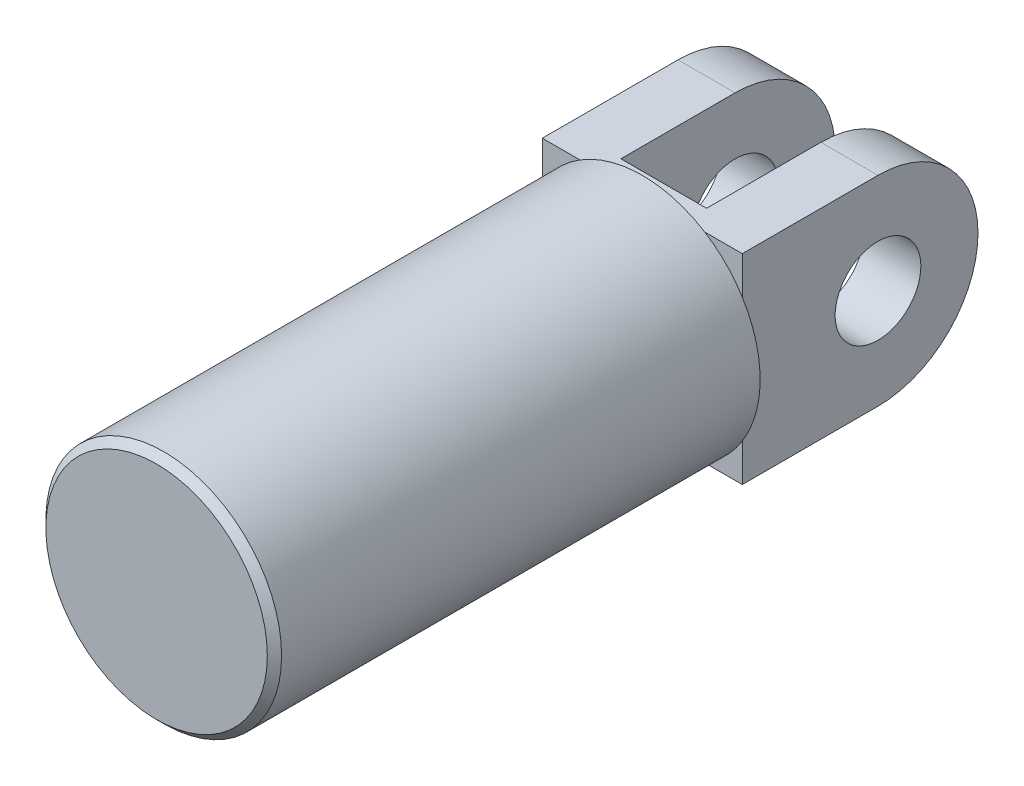
ISO-10303-21;
HEADER;
FILE_DESCRIPTION(('STEP AP214'),'2;1');
FILE_NAME('part.step','',(''),(''),'','','');
FILE_SCHEMA(('AUTOMOTIVE_DESIGN { 1 0 10303 214 1 1 1 1 }'));
ENDSEC;
DATA;
#1=APPLICATION_CONTEXT('core data for automotive mechanical design processes');
#2=APPLICATION_PROTOCOL_DEFINITION('international standard','automotive_design',2000,#1);
#3=PRODUCT_CONTEXT('',#1,'mechanical');
#4=PRODUCT('Part','Part','',(#3));
#5=PRODUCT_RELATED_PRODUCT_CATEGORY('part','',(#4));
#6=PRODUCT_DEFINITION_FORMATION('','',#4);
#7=PRODUCT_DEFINITION_CONTEXT('part definition',#1,'design');
#8=PRODUCT_DEFINITION('design','',#6,#7);
#9=PRODUCT_DEFINITION_SHAPE('','',#8);
#10=(LENGTH_UNIT() NAMED_UNIT(*) SI_UNIT(.MILLI.,.METRE.));
#11=(NAMED_UNIT(*) PLANE_ANGLE_UNIT() SI_UNIT($,.RADIAN.));
#12=(NAMED_UNIT(*) SI_UNIT($,.STERADIAN.) SOLID_ANGLE_UNIT());
#13=UNCERTAINTY_MEASURE_WITH_UNIT(LENGTH_MEASURE(1.E-05),#10,'distance_accuracy_value','');
#14=(GEOMETRIC_REPRESENTATION_CONTEXT(3) GLOBAL_UNCERTAINTY_ASSIGNED_CONTEXT((#13)) GLOBAL_UNIT_ASSIGNED_CONTEXT((#10,
#11,#12)) REPRESENTATION_CONTEXT('',''));
#15=CARTESIAN_POINT('',(0.,0.,0.));
#16=DIRECTION('',(0.,0.,1.));
#17=DIRECTION('',(1.,0.,0.));
#18=AXIS2_PLACEMENT_3D('',#15,#16,#17);
#19=CARTESIAN_POINT('',(14.,-14.,-19.));
#20=DIRECTION('',(0.,1.,0.));
#21=DIRECTION('',(0.,0.,1.));
#22=AXIS2_PLACEMENT_3D('',#19,#20,#21);
#23=PLANE('',#22);
#24=DIRECTION('',(0.,0.,-1.));
#25=VECTOR('',#24,1.);
#26=CARTESIAN_POINT('',(-6.,-14.,-3.));
#27=LINE('',#26,#25);
#28=CARTESIAN_POINT('',(-6.,-14.,-3.));
#29=VERTEX_POINT('',#28);
#30=CARTESIAN_POINT('',(-6.,-14.,-19.));
#31=VERTEX_POINT('',#30);
#32=EDGE_CURVE('E132',#29,#31,#27,.T.);
#33=ORIENTED_EDGE('',*,*,#32,.F.);
#34=DIRECTION('',(1.,0.,0.));
#35=VECTOR('',#34,1.);
#36=CARTESIAN_POINT('',(-6.,-14.,-3.));
#37=LINE('',#36,#35);
#38=CARTESIAN_POINT('',(6.,-14.,-3.));
#39=VERTEX_POINT('',#38);
#40=EDGE_CURVE('E129',#29,#39,#37,.T.);
#41=ORIENTED_EDGE('',*,*,#40,.T.);
#42=DIRECTION('',(0.,0.,-1.));
#43=VECTOR('',#42,1.);
#44=CARTESIAN_POINT('',(6.,-14.,-3.));
#45=LINE('',#44,#43);
#46=CARTESIAN_POINT('',(6.,-14.,-19.));
#47=VERTEX_POINT('',#46);
#48=EDGE_CURVE('E298',#39,#47,#45,.T.);
#49=ORIENTED_EDGE('',*,*,#48,.T.);
#50=DIRECTION('',(-1.,0.,0.));
#51=VECTOR('',#50,1.);
#52=CARTESIAN_POINT('',(14.,-14.,-19.));
#53=LINE('',#52,#51);
#54=CARTESIAN_POINT('',(14.,-14.,-19.));
#55=VERTEX_POINT('',#54);
#56=EDGE_CURVE('E185',#55,#47,#53,.T.);
#57=ORIENTED_EDGE('',*,*,#56,.F.);
#58=DIRECTION('',(0.,0.,-1.));
#59=VECTOR('',#58,1.);
#60=CARTESIAN_POINT('',(14.,-14.,-19.));
#61=LINE('',#60,#59);
#62=CARTESIAN_POINT('',(14.,-14.,0.));
#63=VERTEX_POINT('',#62);
#64=EDGE_CURVE('E160',#63,#55,#61,.T.);
#65=ORIENTED_EDGE('',*,*,#64,.F.);
#66=DIRECTION('',(-1.,0.,0.));
#67=VECTOR('',#66,1.);
#68=CARTESIAN_POINT('',(14.,-14.,0.));
#69=LINE('',#68,#67);
#70=CARTESIAN_POINT('',(8.73212459828649,-14.,0.));
#71=VERTEX_POINT('',#70);
#72=EDGE_CURVE('E189',#63,#71,#69,.T.);
#73=ORIENTED_EDGE('',*,*,#72,.T.);
#74=CARTESIAN_POINT('',(-8.73212459828649,-14.,0.));
#75=VERTEX_POINT('',#74);
#76=EDGE_CURVE('E39',#71,#75,#69,.T.);
#77=ORIENTED_EDGE('',*,*,#76,.T.);
#78=CARTESIAN_POINT('',(-14.,-14.,0.));
#79=VERTEX_POINT('',#78);
#80=EDGE_CURVE('E188',#75,#79,#69,.T.);
#81=ORIENTED_EDGE('',*,*,#80,.T.);
#82=DIRECTION('',(0.,0.,-1.));
#83=VECTOR('',#82,1.);
#84=CARTESIAN_POINT('',(-14.,-14.,-19.));
#85=LINE('',#84,#83);
#86=CARTESIAN_POINT('',(-14.,-14.,-19.));
#87=VERTEX_POINT('',#86);
#88=EDGE_CURVE('E169',#79,#87,#85,.T.);
#89=ORIENTED_EDGE('',*,*,#88,.T.);
#90=EDGE_CURVE('E184',#31,#87,#53,.T.);
#91=ORIENTED_EDGE('',*,*,#90,.F.);
#92=EDGE_LOOP('',(#33,#41,#49,#57,#65,#73,#77,#81,#89,#91));
#93=FACE_BOUND('',#92,.T.);
#94=ADVANCED_FACE('F30',(#93),#23,.F.);
#95=CARTESIAN_POINT('',(14.,0.,-19.));
#96=DIRECTION('',(-1.,0.,0.));
#97=DIRECTION('',(0.,0.,1.));
#98=AXIS2_PLACEMENT_3D('',#95,#96,#97);
#99=CYLINDRICAL_SURFACE('',#98,14.);
#100=CARTESIAN_POINT('',(-6.,0.,-19.));
#101=DIRECTION('',(1.,0.,0.));
#102=DIRECTION('',(0.,0.,-1.));
#103=AXIS2_PLACEMENT_3D('',#100,#101,#102);
#104=CIRCLE('',#103,14.);
#105=CARTESIAN_POINT('',(-6.,14.,-19.));
#106=VERTEX_POINT('',#105);
#107=EDGE_CURVE('E138',#31,#106,#104,.T.);
#108=ORIENTED_EDGE('',*,*,#107,.F.);
#109=ORIENTED_EDGE('',*,*,#90,.T.);
#110=CARTESIAN_POINT('',(-14.,0.,-19.));
#111=DIRECTION('',(1.,0.,0.));
#112=DIRECTION('',(0.,0.,1.));
#113=AXIS2_PLACEMENT_3D('',#110,#111,#112);
#114=CIRCLE('',#113,14.);
#115=CARTESIAN_POINT('',(-14.,14.,-19.));
#116=VERTEX_POINT('',#115);
#117=EDGE_CURVE('E172',#87,#116,#114,.T.);
#118=ORIENTED_EDGE('',*,*,#117,.T.);
#119=DIRECTION('',(-1.,0.,0.));
#120=VECTOR('',#119,1.);
#121=CARTESIAN_POINT('',(14.,14.,-19.));
#122=LINE('',#121,#120);
#123=EDGE_CURVE('E180',#106,#116,#122,.T.);
#124=ORIENTED_EDGE('',*,*,#123,.F.);
#125=EDGE_LOOP('',(#108,#109,#118,#124));
#126=FACE_BOUND('',#125,.T.);
#127=ADVANCED_FACE('F221',(#126),#99,.T.);
#128=CARTESIAN_POINT('',(14.,14.,0.));
#129=DIRECTION('',(0.,-1.,0.));
#130=DIRECTION('',(0.,0.,-1.));
#131=AXIS2_PLACEMENT_3D('',#128,#129,#130);
#132=PLANE('',#131);
#133=DIRECTION('',(0.,0.,1.));
#134=VECTOR('',#133,1.);
#135=CARTESIAN_POINT('',(-6.,14.,-19.));
#136=LINE('',#135,#134);
#137=CARTESIAN_POINT('',(-6.,14.,-3.));
#138=VERTEX_POINT('',#137);
#139=EDGE_CURVE('E133',#106,#138,#136,.T.);
#140=ORIENTED_EDGE('',*,*,#139,.F.);
#141=ORIENTED_EDGE('',*,*,#123,.T.);
#142=DIRECTION('',(0.,0.,1.));
#143=VECTOR('',#142,1.);
#144=CARTESIAN_POINT('',(-14.,14.,0.));
#145=LINE('',#144,#143);
#146=CARTESIAN_POINT('',(-14.,14.,0.));
#147=VERTEX_POINT('',#146);
#148=EDGE_CURVE('E175',#116,#147,#145,.T.);
#149=ORIENTED_EDGE('',*,*,#148,.T.);
#150=DIRECTION('',(-1.,0.,0.));
#151=VECTOR('',#150,1.);
#152=CARTESIAN_POINT('',(14.,14.,0.));
#153=LINE('',#152,#151);
#154=CARTESIAN_POINT('',(-8.73212459828649,14.,0.));
#155=VERTEX_POINT('',#154);
#156=EDGE_CURVE('E57',#155,#147,#153,.T.);
#157=ORIENTED_EDGE('',*,*,#156,.F.);
#158=CARTESIAN_POINT('',(8.73212459828649,14.,0.));
#159=VERTEX_POINT('',#158);
#160=EDGE_CURVE('E181',#159,#155,#153,.T.);
#161=ORIENTED_EDGE('',*,*,#160,.F.);
#162=CARTESIAN_POINT('',(14.,14.,0.));
#163=VERTEX_POINT('',#162);
#164=EDGE_CURVE('E177',#163,#159,#153,.T.);
#165=ORIENTED_EDGE('',*,*,#164,.F.);
#166=DIRECTION('',(0.,0.,1.));
#167=VECTOR('',#166,1.);
#168=CARTESIAN_POINT('',(14.,14.,0.));
#169=LINE('',#168,#167);
#170=CARTESIAN_POINT('',(14.,14.,-19.));
#171=VERTEX_POINT('',#170);
#172=EDGE_CURVE('E166',#171,#163,#169,.T.);
#173=ORIENTED_EDGE('',*,*,#172,.F.);
#174=CARTESIAN_POINT('',(6.,14.,-19.));
#175=VERTEX_POINT('',#174);
#176=EDGE_CURVE('E182',#171,#175,#122,.T.);
#177=ORIENTED_EDGE('',*,*,#176,.T.);
#178=DIRECTION('',(0.,0.,1.));
#179=VECTOR('',#178,1.);
#180=CARTESIAN_POINT('',(6.,14.,-19.));
#181=LINE('',#180,#179);
#182=CARTESIAN_POINT('',(6.,14.,-3.));
#183=VERTEX_POINT('',#182);
#184=EDGE_CURVE('E144',#175,#183,#181,.T.);
#185=ORIENTED_EDGE('',*,*,#184,.T.);
#186=DIRECTION('',(1.,0.,0.));
#187=VECTOR('',#186,1.);
#188=CARTESIAN_POINT('',(-6.,14.,-3.));
#189=LINE('',#188,#187);
#190=EDGE_CURVE('E126',#138,#183,#189,.T.);
#191=ORIENTED_EDGE('',*,*,#190,.F.);
#192=EDGE_LOOP('',(#140,#141,#149,#157,#161,#165,#173,#177,#185,#191));
#193=FACE_BOUND('',#192,.T.);
#194=ADVANCED_FACE('F142',(#193),#132,.F.);
#195=CARTESIAN_POINT('',(14.,0.,-19.));
#196=DIRECTION('',(-1.,0.,0.));
#197=DIRECTION('',(0.,0.,1.));
#198=AXIS2_PLACEMENT_3D('',#195,#196,#197);
#199=CYLINDRICAL_SURFACE('',#198,6.);
#200=CARTESIAN_POINT('',(-14.,0.,-19.));
#201=DIRECTION('',(1.,0.,0.));
#202=DIRECTION('',(0.,0.,-1.));
#203=AXIS2_PLACEMENT_3D('',#200,#201,#202);
#204=CIRCLE('',#203,6.);
#205=CARTESIAN_POINT('',(-14.,0.,-25.));
#206=VERTEX_POINT('',#205);
#207=EDGE_CURVE('E154',#206,#206,#204,.T.);
#208=ORIENTED_EDGE('',*,*,#207,.F.);
#209=EDGE_LOOP('',(#208));
#210=FACE_BOUND('',#209,.T.);
#211=CARTESIAN_POINT('',(-6.,0.,-19.));
#212=DIRECTION('',(1.,0.,0.));
#213=DIRECTION('',(0.,0.,-1.));
#214=AXIS2_PLACEMENT_3D('',#211,#212,#213);
#215=CIRCLE('',#214,6.);
#216=CARTESIAN_POINT('',(-6.,0.,-25.));
#217=VERTEX_POINT('',#216);
#218=EDGE_CURVE('E34',#217,#217,#215,.T.);
#219=ORIENTED_EDGE('',*,*,#218,.T.);
#220=EDGE_LOOP('',(#219));
#221=FACE_BOUND('',#220,.T.);
#222=ADVANCED_FACE('F208',(#210,#221),#199,.F.);
#223=CARTESIAN_POINT('',(0.,0.,0.));
#224=DIRECTION('',(0.,0.,1.));
#225=DIRECTION('',(1.,0.,0.));
#226=AXIS2_PLACEMENT_3D('',#223,#224,#225);
#227=PLANE('',#226);
#228=ORIENTED_EDGE('',*,*,#76,.F.);
#229=CARTESIAN_POINT('',(0.,0.,0.));
#230=DIRECTION('',(0.,0.,1.));
#231=DIRECTION('',(1.,0.,0.));
#232=AXIS2_PLACEMENT_3D('',#229,#230,#231);
#233=CIRCLE('',#232,16.5);
#234=EDGE_CURVE('E284',#75,#71,#233,.T.);
#235=ORIENTED_EDGE('',*,*,#234,.F.);
#236=EDGE_LOOP('',(#228,#235));
#237=FACE_BOUND('',#236,.T.);
#238=ADVANCED_FACE('F247',(#237),#227,.F.);
#239=DIRECTION('',(0.,-1.,0.));
#240=VECTOR('',#239,1.);
#241=CARTESIAN_POINT('',(14.,-14.,0.));
#242=LINE('',#241,#240);
#243=CARTESIAN_POINT('',(14.,8.73212459828649,0.));
#244=VERTEX_POINT('',#243);
#245=CARTESIAN_POINT('',(14.,-8.73212459828649,0.));
#246=VERTEX_POINT('',#245);
#247=EDGE_CURVE('E162',#244,#246,#242,.T.);
#248=ORIENTED_EDGE('',*,*,#247,.F.);
#249=EDGE_CURVE('E192',#246,#244,#233,.T.);
#250=ORIENTED_EDGE('',*,*,#249,.F.);
#251=EDGE_LOOP('',(#248,#250));
#252=FACE_BOUND('',#251,.T.);
#253=ADVANCED_FACE('F254',(#252),#227,.F.);
#254=CARTESIAN_POINT('',(-14.,8.73212459828649,0.));
#255=VERTEX_POINT('',#254);
#256=CARTESIAN_POINT('',(-14.,-8.73212459828649,0.));
#257=VERTEX_POINT('',#256);
#258=EDGE_CURVE('E288',#255,#257,#233,.T.);
#259=ORIENTED_EDGE('',*,*,#258,.F.);
#260=DIRECTION('',(0.,-1.,0.));
#261=VECTOR('',#260,1.);
#262=CARTESIAN_POINT('',(-14.,-14.,0.));
#263=LINE('',#262,#261);
#264=EDGE_CURVE('E11',#255,#257,#263,.T.);
#265=ORIENTED_EDGE('',*,*,#264,.T.);
#266=EDGE_LOOP('',(#259,#265));
#267=FACE_BOUND('',#266,.T.);
#268=ADVANCED_FACE('F248',(#267),#227,.F.);
#269=CARTESIAN_POINT('',(0.,0.,68.));
#270=DIRECTION('',(0.,0.,-1.));
#271=DIRECTION('',(-1.,0.,0.));
#272=AXIS2_PLACEMENT_3D('',#269,#270,#271);
#273=CYLINDRICAL_SURFACE('',#272,16.5);
#274=CARTESIAN_POINT('',(0.,0.,67.));
#275=DIRECTION('',(0.,0.,1.));
#276=DIRECTION('',(1.,0.,0.));
#277=AXIS2_PLACEMENT_3D('',#274,#275,#276);
#278=CIRCLE('',#277,16.5);
#279=CARTESIAN_POINT('',(16.5,0.,67.));
#280=VERTEX_POINT('',#279);
#281=EDGE_CURVE('E200',#280,#280,#278,.F.);
#282=ORIENTED_EDGE('',*,*,#281,.T.);
#283=EDGE_LOOP('',(#282));
#284=FACE_BOUND('',#283,.T.);
#285=EDGE_CURVE('E193',#244,#159,#233,.T.);
#286=ORIENTED_EDGE('',*,*,#285,.T.);
#287=EDGE_CURVE('E197',#159,#155,#233,.T.);
#288=ORIENTED_EDGE('',*,*,#287,.T.);
#289=EDGE_CURVE('E290',#155,#255,#233,.T.);
#290=ORIENTED_EDGE('',*,*,#289,.T.);
#291=ORIENTED_EDGE('',*,*,#258,.T.);
#292=EDGE_CURVE('E285',#257,#75,#233,.T.);
#293=ORIENTED_EDGE('',*,*,#292,.T.);
#294=ORIENTED_EDGE('',*,*,#234,.T.);
#295=EDGE_CURVE('E282',#71,#246,#233,.T.);
#296=ORIENTED_EDGE('',*,*,#295,.T.);
#297=ORIENTED_EDGE('',*,*,#249,.T.);
#298=EDGE_LOOP('',(#286,#288,#290,#291,#293,#294,#296,#297));
#299=FACE_BOUND('',#298,.T.);
#300=ADVANCED_FACE('F243',(#284,#299),#273,.T.);
#301=CARTESIAN_POINT('',(0.,0.,68.));
#302=DIRECTION('',(0.,0.,1.));
#303=DIRECTION('',(1.,0.,0.));
#304=AXIS2_PLACEMENT_3D('',#301,#302,#303);
#305=PLANE('',#304);
#306=CARTESIAN_POINT('',(0.,0.,68.));
#307=DIRECTION('',(0.,0.,1.));
#308=DIRECTION('',(1.,0.,0.));
#309=AXIS2_PLACEMENT_3D('',#306,#307,#308);
#310=CIRCLE('',#309,15.5);
#311=CARTESIAN_POINT('',(15.5,0.,68.));
#312=VERTEX_POINT('',#311);
#313=EDGE_CURVE('E196',#312,#312,#310,.T.);
#314=ORIENTED_EDGE('',*,*,#313,.T.);
#315=EDGE_LOOP('',(#314));
#316=FACE_BOUND('',#315,.T.);
#317=ADVANCED_FACE('F239',(#316),#305,.T.);
#318=ORIENTED_EDGE('',*,*,#287,.F.);
#319=ORIENTED_EDGE('',*,*,#160,.T.);
#320=EDGE_LOOP('',(#318,#319));
#321=FACE_BOUND('',#320,.T.);
#322=ADVANCED_FACE('F242',(#321),#227,.F.);
#323=CARTESIAN_POINT('',(0.,0.,68.));
#324=DIRECTION('',(0.,0.,-1.));
#325=DIRECTION('',(-1.,0.,0.));
#326=AXIS2_PLACEMENT_3D('',#323,#324,#325);
#327=CONICAL_SURFACE('',#326,15.5,0.785398163397434);
#328=ORIENTED_EDGE('',*,*,#281,.F.);
#329=EDGE_LOOP('',(#328));
#330=FACE_BOUND('',#329,.T.);
#331=ORIENTED_EDGE('',*,*,#313,.F.);
#332=EDGE_LOOP('',(#331));
#333=FACE_BOUND('',#332,.T.);
#334=ADVANCED_FACE('F32',(#330,#333),#327,.T.);
#335=CARTESIAN_POINT('',(14.,-14.,0.));
#336=DIRECTION('',(0.,0.,-1.));
#337=DIRECTION('',(-1.,0.,0.));
#338=AXIS2_PLACEMENT_3D('',#335,#336,#337);
#339=PLANE('',#338);
#340=ORIENTED_EDGE('',*,*,#285,.F.);
#341=EDGE_CURVE('E157',#163,#244,#242,.T.);
#342=ORIENTED_EDGE('',*,*,#341,.F.);
#343=ORIENTED_EDGE('',*,*,#164,.T.);
#344=EDGE_LOOP('',(#340,#342,#343));
#345=FACE_BOUND('',#344,.T.);
#346=ADVANCED_FACE('F237',(#345),#339,.F.);
#347=ORIENTED_EDGE('',*,*,#289,.F.);
#348=ORIENTED_EDGE('',*,*,#156,.T.);
#349=EDGE_CURVE('E41',#147,#255,#263,.T.);
#350=ORIENTED_EDGE('',*,*,#349,.T.);
#351=EDGE_LOOP('',(#347,#348,#350));
#352=FACE_BOUND('',#351,.T.);
#353=ADVANCED_FACE('F293',(#352),#339,.F.);
#354=ORIENTED_EDGE('',*,*,#292,.F.);
#355=EDGE_CURVE('E42',#257,#79,#263,.T.);
#356=ORIENTED_EDGE('',*,*,#355,.T.);
#357=ORIENTED_EDGE('',*,*,#80,.F.);
#358=EDGE_LOOP('',(#354,#356,#357));
#359=FACE_BOUND('',#358,.T.);
#360=ADVANCED_FACE('F238',(#359),#339,.F.);
#361=CARTESIAN_POINT('',(14.,0.,-19.));
#362=DIRECTION('',(-1.,0.,0.));
#363=DIRECTION('',(0.,0.,1.));
#364=AXIS2_PLACEMENT_3D('',#361,#362,#363);
#365=PLANE('',#364);
#366=ORIENTED_EDGE('',*,*,#341,.T.);
#367=ORIENTED_EDGE('',*,*,#247,.T.);
#368=EDGE_CURVE('E161',#246,#63,#242,.T.);
#369=ORIENTED_EDGE('',*,*,#368,.T.);
#370=ORIENTED_EDGE('',*,*,#64,.T.);
#371=CARTESIAN_POINT('',(14.,0.,-19.));
#372=DIRECTION('',(1.,0.,0.));
#373=DIRECTION('',(0.,0.,1.));
#374=AXIS2_PLACEMENT_3D('',#371,#372,#373);
#375=CIRCLE('',#374,14.);
#376=EDGE_CURVE('E164',#55,#171,#375,.T.);
#377=ORIENTED_EDGE('',*,*,#376,.T.);
#378=ORIENTED_EDGE('',*,*,#172,.T.);
#379=EDGE_LOOP('',(#366,#367,#369,#370,#377,#378));
#380=FACE_BOUND('',#379,.T.);
#381=CARTESIAN_POINT('',(14.,0.,-19.));
#382=DIRECTION('',(1.,0.,0.));
#383=DIRECTION('',(0.,0.,-1.));
#384=AXIS2_PLACEMENT_3D('',#381,#382,#383);
#385=CIRCLE('',#384,6.);
#386=CARTESIAN_POINT('',(14.,0.,-25.));
#387=VERTEX_POINT('',#386);
#388=EDGE_CURVE('E151',#387,#387,#385,.T.);
#389=ORIENTED_EDGE('',*,*,#388,.F.);
#390=EDGE_LOOP('',(#389));
#391=FACE_BOUND('',#390,.T.);
#392=ADVANCED_FACE('F270',(#380,#391),#365,.F.);
#393=CARTESIAN_POINT('',(-14.,0.,-19.));
#394=DIRECTION('',(-1.,0.,0.));
#395=DIRECTION('',(0.,0.,1.));
#396=AXIS2_PLACEMENT_3D('',#393,#394,#395);
#397=PLANE('',#396);
#398=ORIENTED_EDGE('',*,*,#349,.F.);
#399=ORIENTED_EDGE('',*,*,#148,.F.);
#400=ORIENTED_EDGE('',*,*,#117,.F.);
#401=ORIENTED_EDGE('',*,*,#88,.F.);
#402=ORIENTED_EDGE('',*,*,#355,.F.);
#403=ORIENTED_EDGE('',*,*,#264,.F.);
#404=EDGE_LOOP('',(#398,#399,#400,#401,#402,#403));
#405=FACE_BOUND('',#404,.T.);
#406=ORIENTED_EDGE('',*,*,#207,.T.);
#407=EDGE_LOOP('',(#406));
#408=FACE_BOUND('',#407,.T.);
#409=ADVANCED_FACE('F235',(#405,#408),#397,.T.);
#410=ORIENTED_EDGE('',*,*,#295,.F.);
#411=ORIENTED_EDGE('',*,*,#72,.F.);
#412=ORIENTED_EDGE('',*,*,#368,.F.);
#413=EDGE_LOOP('',(#410,#411,#412));
#414=FACE_BOUND('',#413,.T.);
#415=ADVANCED_FACE('F232',(#414),#339,.F.);
#416=ORIENTED_EDGE('',*,*,#56,.T.);
#417=CARTESIAN_POINT('',(6.,0.,-19.));
#418=DIRECTION('',(1.,0.,0.));
#419=DIRECTION('',(0.,0.,-1.));
#420=AXIS2_PLACEMENT_3D('',#417,#418,#419);
#421=CIRCLE('',#420,14.);
#422=EDGE_CURVE('E140',#47,#175,#421,.T.);
#423=ORIENTED_EDGE('',*,*,#422,.T.);
#424=ORIENTED_EDGE('',*,*,#176,.F.);
#425=ORIENTED_EDGE('',*,*,#376,.F.);
#426=EDGE_LOOP('',(#416,#423,#424,#425));
#427=FACE_BOUND('',#426,.T.);
#428=ADVANCED_FACE('F229',(#427),#99,.T.);
#429=CARTESIAN_POINT('',(6.,0.,-19.));
#430=DIRECTION('',(1.,0.,0.));
#431=DIRECTION('',(0.,0.,-1.));
#432=AXIS2_PLACEMENT_3D('',#429,#430,#431);
#433=CIRCLE('',#432,6.);
#434=CARTESIAN_POINT('',(6.,0.,-25.));
#435=VERTEX_POINT('',#434);
#436=EDGE_CURVE('E146',#435,#435,#433,.T.);
#437=ORIENTED_EDGE('',*,*,#436,.F.);
#438=EDGE_LOOP('',(#437));
#439=FACE_BOUND('',#438,.T.);
#440=ORIENTED_EDGE('',*,*,#388,.T.);
#441=EDGE_LOOP('',(#440));
#442=FACE_BOUND('',#441,.T.);
#443=ADVANCED_FACE('F218',(#439,#442),#199,.F.);
#444=CARTESIAN_POINT('',(-6.,14.,-3.));
#445=DIRECTION('',(0.,0.,1.));
#446=DIRECTION('',(0.,-1.,0.));
#447=AXIS2_PLACEMENT_3D('',#444,#445,#446);
#448=PLANE('',#447);
#449=DIRECTION('',(0.,-1.,0.));
#450=VECTOR('',#449,1.);
#451=CARTESIAN_POINT('',(6.,14.,-3.));
#452=LINE('',#451,#450);
#453=EDGE_CURVE('E49',#183,#39,#452,.T.);
#454=ORIENTED_EDGE('',*,*,#453,.T.);
#455=ORIENTED_EDGE('',*,*,#40,.F.);
#456=DIRECTION('',(0.,-1.,0.));
#457=VECTOR('',#456,1.);
#458=CARTESIAN_POINT('',(-6.,14.,-3.));
#459=LINE('',#458,#457);
#460=EDGE_CURVE('E122',#138,#29,#459,.T.);
#461=ORIENTED_EDGE('',*,*,#460,.F.);
#462=ORIENTED_EDGE('',*,*,#190,.T.);
#463=EDGE_LOOP('',(#454,#455,#461,#462));
#464=FACE_BOUND('',#463,.T.);
#465=ADVANCED_FACE('F124',(#464),#448,.F.);
#466=CARTESIAN_POINT('',(-6.,0.,-19.));
#467=DIRECTION('',(1.,0.,0.));
#468=DIRECTION('',(0.,0.,-1.));
#469=AXIS2_PLACEMENT_3D('',#466,#467,#468);
#470=PLANE('',#469);
#471=ORIENTED_EDGE('',*,*,#218,.F.);
#472=EDGE_LOOP('',(#471));
#473=FACE_BOUND('',#472,.T.);
#474=ORIENTED_EDGE('',*,*,#139,.T.);
#475=ORIENTED_EDGE('',*,*,#460,.T.);
#476=ORIENTED_EDGE('',*,*,#32,.T.);
#477=ORIENTED_EDGE('',*,*,#107,.T.);
#478=EDGE_LOOP('',(#474,#475,#476,#477));
#479=FACE_BOUND('',#478,.T.);
#480=ADVANCED_FACE('F136',(#473,#479),#470,.T.);
#481=CARTESIAN_POINT('',(6.,0.,-19.));
#482=DIRECTION('',(1.,0.,0.));
#483=DIRECTION('',(0.,0.,-1.));
#484=AXIS2_PLACEMENT_3D('',#481,#482,#483);
#485=PLANE('',#484);
#486=ORIENTED_EDGE('',*,*,#436,.T.);
#487=EDGE_LOOP('',(#486));
#488=FACE_BOUND('',#487,.T.);
#489=ORIENTED_EDGE('',*,*,#184,.F.);
#490=ORIENTED_EDGE('',*,*,#422,.F.);
#491=ORIENTED_EDGE('',*,*,#48,.F.);
#492=ORIENTED_EDGE('',*,*,#453,.F.);
#493=EDGE_LOOP('',(#489,#490,#491,#492));
#494=FACE_BOUND('',#493,.T.);
#495=ADVANCED_FACE('F211',(#488,#494),#485,.F.);
#496=CLOSED_SHELL('',(#94,#127,#194,#222,#238,#253,#268,#300,#317,#322,#334,#346,#353,#360,#392,
#409,#415,#428,#443,#465,#480,#495));
#497=MANIFOLD_SOLID_BREP('B2',#496);
#498=ADVANCED_BREP_SHAPE_REPRESENTATION('',(#18,#497),#14);
#499=SHAPE_DEFINITION_REPRESENTATION(#9,#498);
ENDSEC;
END-ISO-10303-21;
